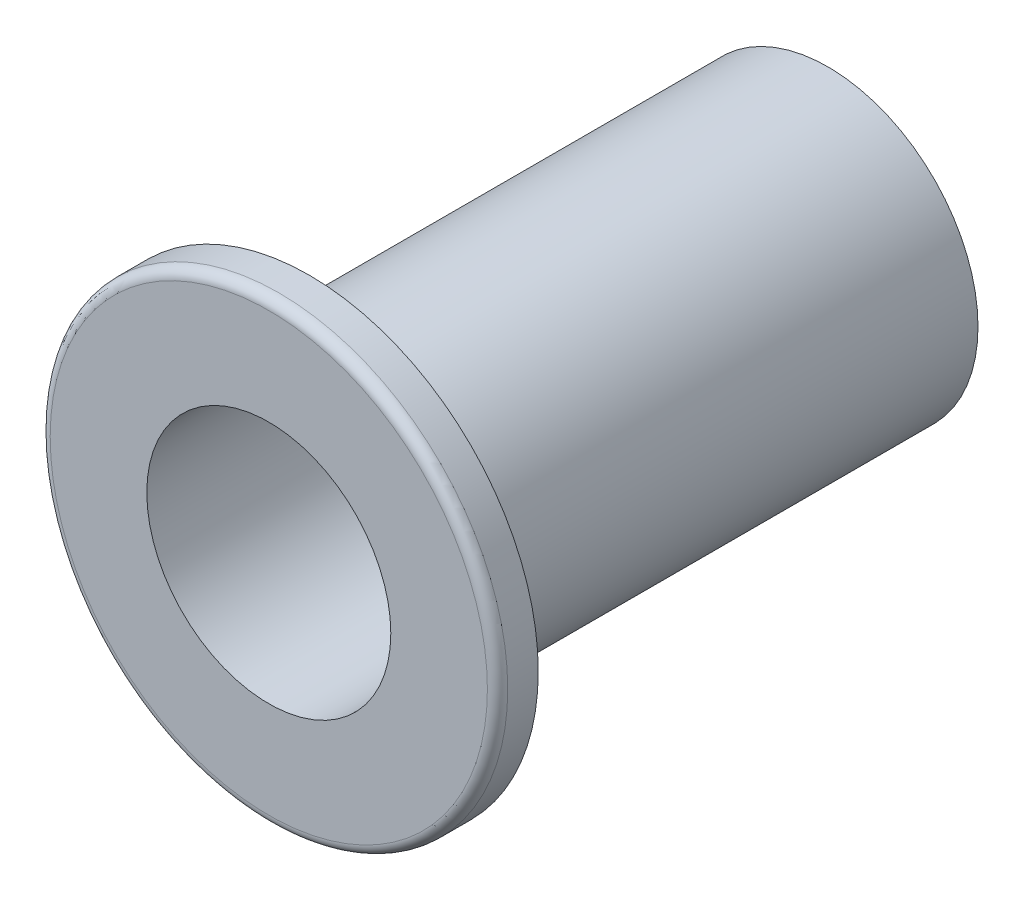
ISO-10303-21;
HEADER;
FILE_DESCRIPTION(('STEP AP214'),'2;1');
FILE_NAME('part.step','',(''),(''),'','','');
FILE_SCHEMA(('AUTOMOTIVE_DESIGN { 1 0 10303 214 1 1 1 1 }'));
ENDSEC;
DATA;
#1=APPLICATION_CONTEXT('core data for automotive mechanical design processes');
#2=APPLICATION_PROTOCOL_DEFINITION('international standard','automotive_design',2000,#1);
#3=PRODUCT_CONTEXT('',#1,'mechanical');
#4=PRODUCT('Part','Part','',(#3));
#5=PRODUCT_RELATED_PRODUCT_CATEGORY('part','',(#4));
#6=PRODUCT_DEFINITION_FORMATION('','',#4);
#7=PRODUCT_DEFINITION_CONTEXT('part definition',#1,'design');
#8=PRODUCT_DEFINITION('design','',#6,#7);
#9=PRODUCT_DEFINITION_SHAPE('','',#8);
#10=(LENGTH_UNIT() NAMED_UNIT(*) SI_UNIT(.MILLI.,.METRE.));
#11=(NAMED_UNIT(*) PLANE_ANGLE_UNIT() SI_UNIT($,.RADIAN.));
#12=(NAMED_UNIT(*) SI_UNIT($,.STERADIAN.) SOLID_ANGLE_UNIT());
#13=UNCERTAINTY_MEASURE_WITH_UNIT(LENGTH_MEASURE(1.E-05),#10,'distance_accuracy_value','');
#14=(GEOMETRIC_REPRESENTATION_CONTEXT(3) GLOBAL_UNCERTAINTY_ASSIGNED_CONTEXT((#13)) GLOBAL_UNIT_ASSIGNED_CONTEXT((#10,
#11,#12)) REPRESENTATION_CONTEXT('',''));
#15=CARTESIAN_POINT('',(0.,0.,0.));
#16=DIRECTION('',(0.,0.,1.));
#17=DIRECTION('',(1.,0.,0.));
#18=AXIS2_PLACEMENT_3D('',#15,#16,#17);
#19=CARTESIAN_POINT('',(0.,0.,0.));
#20=DIRECTION('',(0.,0.,1.));
#21=DIRECTION('',(1.,0.,0.));
#22=AXIS2_PLACEMENT_3D('',#19,#20,#21);
#23=CYLINDRICAL_SURFACE('',#22,4.5);
#24=CARTESIAN_POINT('',(0.,0.,0.6));
#25=DIRECTION('',(0.,0.,-1.));
#26=DIRECTION('',(-1.,0.,0.));
#27=AXIS2_PLACEMENT_3D('',#24,#25,#26);
#28=CIRCLE('',#27,4.5);
#29=CARTESIAN_POINT('',(-4.5,0.,0.6));
#30=VERTEX_POINT('',#29);
#31=EDGE_CURVE('E10',#30,#30,#28,.T.);
#32=ORIENTED_EDGE('',*,*,#31,.T.);
#33=EDGE_LOOP('',(#32));
#34=FACE_BOUND('',#33,.T.);
#35=CARTESIAN_POINT('',(0.,0.,0.));
#36=DIRECTION('',(0.,0.,1.));
#37=DIRECTION('',(1.,0.,0.));
#38=AXIS2_PLACEMENT_3D('',#35,#36,#37);
#39=CIRCLE('',#38,4.5);
#40=CARTESIAN_POINT('',(4.5,0.,0.));
#41=VERTEX_POINT('',#40);
#42=EDGE_CURVE('E66',#41,#41,#39,.T.);
#43=ORIENTED_EDGE('',*,*,#42,.T.);
#44=EDGE_LOOP('',(#43));
#45=FACE_BOUND('',#44,.T.);
#46=ADVANCED_FACE('F34',(#34,#45),#23,.T.);
#47=CARTESIAN_POINT('',(0.,4.5,0.8));
#48=DIRECTION('',(0.,0.,-1.));
#49=DIRECTION('',(-1.,0.,0.));
#50=AXIS2_PLACEMENT_3D('',#47,#48,#49);
#51=PLANE('',#50);
#52=CARTESIAN_POINT('',(0.,0.,0.8));
#53=DIRECTION('',(0.,0.,-1.));
#54=DIRECTION('',(-1.,0.,0.));
#55=AXIS2_PLACEMENT_3D('',#52,#53,#54);
#56=CIRCLE('',#55,4.3);
#57=CARTESIAN_POINT('',(-4.3,0.,0.8));
#58=VERTEX_POINT('',#57);
#59=EDGE_CURVE('E41',#58,#58,#56,.F.);
#60=ORIENTED_EDGE('',*,*,#59,.T.);
#61=EDGE_LOOP('',(#60));
#62=FACE_BOUND('',#61,.T.);
#63=CARTESIAN_POINT('',(0.,0.,0.8));
#64=DIRECTION('',(0.,0.,1.));
#65=DIRECTION('',(1.,0.,0.));
#66=AXIS2_PLACEMENT_3D('',#63,#64,#65);
#67=CIRCLE('',#66,2.4);
#68=CARTESIAN_POINT('',(2.4,0.,0.8));
#69=VERTEX_POINT('',#68);
#70=EDGE_CURVE('E45',#69,#69,#67,.T.);
#71=ORIENTED_EDGE('',*,*,#70,.F.);
#72=EDGE_LOOP('',(#71));
#73=FACE_BOUND('',#72,.T.);
#74=ADVANCED_FACE('F104',(#62,#73),#51,.F.);
#75=CARTESIAN_POINT('',(0.,0.,0.));
#76=DIRECTION('',(0.,0.,1.));
#77=DIRECTION('',(1.,0.,0.));
#78=AXIS2_PLACEMENT_3D('',#75,#76,#77);
#79=CYLINDRICAL_SURFACE('',#78,2.4);
#80=CARTESIAN_POINT('',(0.,0.,-4.2));
#81=DIRECTION('',(0.,0.,1.));
#82=DIRECTION('',(1.,0.,0.));
#83=AXIS2_PLACEMENT_3D('',#80,#81,#82);
#84=CIRCLE('',#83,2.4);
#85=CARTESIAN_POINT('',(2.4,0.,-4.2));
#86=VERTEX_POINT('',#85);
#87=EDGE_CURVE('E49',#86,#86,#84,.T.);
#88=ORIENTED_EDGE('',*,*,#87,.F.);
#89=EDGE_LOOP('',(#88));
#90=FACE_BOUND('',#89,.T.);
#91=ORIENTED_EDGE('',*,*,#70,.T.);
#92=EDGE_LOOP('',(#91));
#93=FACE_BOUND('',#92,.T.);
#94=ADVANCED_FACE('F98',(#90,#93),#79,.F.);
#95=CARTESIAN_POINT('',(0.,2.,-4.2));
#96=DIRECTION('',(0.,0.,-1.));
#97=DIRECTION('',(-1.,0.,0.));
#98=AXIS2_PLACEMENT_3D('',#95,#96,#97);
#99=PLANE('',#98);
#100=CARTESIAN_POINT('',(0.,0.,-4.2));
#101=DIRECTION('',(0.,0.,1.));
#102=DIRECTION('',(1.,0.,0.));
#103=AXIS2_PLACEMENT_3D('',#100,#101,#102);
#104=CIRCLE('',#103,2.);
#105=CARTESIAN_POINT('',(2.,0.,-4.2));
#106=VERTEX_POINT('',#105);
#107=EDGE_CURVE('E54',#106,#106,#104,.T.);
#108=ORIENTED_EDGE('',*,*,#107,.F.);
#109=EDGE_LOOP('',(#108));
#110=FACE_BOUND('',#109,.T.);
#111=ORIENTED_EDGE('',*,*,#87,.T.);
#112=EDGE_LOOP('',(#111));
#113=FACE_BOUND('',#112,.T.);
#114=ADVANCED_FACE('F92',(#110,#113),#99,.F.);
#115=CARTESIAN_POINT('',(0.,0.,0.));
#116=DIRECTION('',(0.,0.,1.));
#117=DIRECTION('',(1.,0.,0.));
#118=AXIS2_PLACEMENT_3D('',#115,#116,#117);
#119=CYLINDRICAL_SURFACE('',#118,2.);
#120=CARTESIAN_POINT('',(0.,0.,-10.2));
#121=DIRECTION('',(0.,0.,1.));
#122=DIRECTION('',(1.,0.,0.));
#123=AXIS2_PLACEMENT_3D('',#120,#121,#122);
#124=CIRCLE('',#123,2.);
#125=CARTESIAN_POINT('',(2.,0.,-10.2));
#126=VERTEX_POINT('',#125);
#127=EDGE_CURVE('E57',#126,#126,#124,.T.);
#128=ORIENTED_EDGE('',*,*,#127,.F.);
#129=EDGE_LOOP('',(#128));
#130=FACE_BOUND('',#129,.T.);
#131=ORIENTED_EDGE('',*,*,#107,.T.);
#132=EDGE_LOOP('',(#131));
#133=FACE_BOUND('',#132,.T.);
#134=ADVANCED_FACE('F86',(#130,#133),#119,.F.);
#135=CARTESIAN_POINT('',(0.,2.,-10.2));
#136=DIRECTION('',(0.,0.,1.));
#137=DIRECTION('',(1.,0.,0.));
#138=AXIS2_PLACEMENT_3D('',#135,#136,#137);
#139=PLANE('',#138);
#140=CARTESIAN_POINT('',(0.,0.,-10.2));
#141=DIRECTION('',(0.,0.,1.));
#142=DIRECTION('',(1.,0.,0.));
#143=AXIS2_PLACEMENT_3D('',#140,#141,#142);
#144=CIRCLE('',#143,2.95);
#145=CARTESIAN_POINT('',(2.95,0.,-10.2));
#146=VERTEX_POINT('',#145);
#147=EDGE_CURVE('E60',#146,#146,#144,.T.);
#148=ORIENTED_EDGE('',*,*,#147,.F.);
#149=EDGE_LOOP('',(#148));
#150=FACE_BOUND('',#149,.T.);
#151=ORIENTED_EDGE('',*,*,#127,.T.);
#152=EDGE_LOOP('',(#151));
#153=FACE_BOUND('',#152,.T.);
#154=ADVANCED_FACE('F80',(#150,#153),#139,.F.);
#155=CARTESIAN_POINT('',(0.,0.,0.));
#156=DIRECTION('',(0.,0.,1.));
#157=DIRECTION('',(1.,0.,0.));
#158=AXIS2_PLACEMENT_3D('',#155,#156,#157);
#159=CYLINDRICAL_SURFACE('',#158,2.95);
#160=CARTESIAN_POINT('',(0.,0.,0.));
#161=DIRECTION('',(0.,0.,1.));
#162=DIRECTION('',(1.,0.,0.));
#163=AXIS2_PLACEMENT_3D('',#160,#161,#162);
#164=CIRCLE('',#163,2.95);
#165=CARTESIAN_POINT('',(2.95,0.,0.));
#166=VERTEX_POINT('',#165);
#167=EDGE_CURVE('E63',#166,#166,#164,.T.);
#168=ORIENTED_EDGE('',*,*,#167,.F.);
#169=EDGE_LOOP('',(#168));
#170=FACE_BOUND('',#169,.T.);
#171=ORIENTED_EDGE('',*,*,#147,.T.);
#172=EDGE_LOOP('',(#171));
#173=FACE_BOUND('',#172,.T.);
#174=ADVANCED_FACE('F74',(#170,#173),#159,.T.);
#175=CARTESIAN_POINT('',(0.,2.95,0.));
#176=DIRECTION('',(0.,0.,1.));
#177=DIRECTION('',(1.,0.,0.));
#178=AXIS2_PLACEMENT_3D('',#175,#176,#177);
#179=PLANE('',#178);
#180=ORIENTED_EDGE('',*,*,#42,.F.);
#181=EDGE_LOOP('',(#180));
#182=FACE_BOUND('',#181,.T.);
#183=ORIENTED_EDGE('',*,*,#167,.T.);
#184=EDGE_LOOP('',(#183));
#185=FACE_BOUND('',#184,.T.);
#186=ADVANCED_FACE('F71',(#182,#185),#179,.F.);
#187=CARTESIAN_POINT('',(0.,0.,0.6));
#188=DIRECTION('',(0.,0.,-1.));
#189=DIRECTION('',(-1.,0.,0.));
#190=AXIS2_PLACEMENT_3D('',#187,#188,#189);
#191=TOROIDAL_SURFACE('',#190,4.3,0.2);
#192=ORIENTED_EDGE('',*,*,#31,.F.);
#193=EDGE_LOOP('',(#192));
#194=FACE_BOUND('',#193,.T.);
#195=ORIENTED_EDGE('',*,*,#59,.F.);
#196=EDGE_LOOP('',(#195));
#197=FACE_BOUND('',#196,.T.);
#198=ADVANCED_FACE('F36',(#194,#197),#191,.T.);
#199=CLOSED_SHELL('',(#46,#74,#94,#114,#134,#154,#174,#186,#198));
#200=MANIFOLD_SOLID_BREP('B2',#199);
#201=ADVANCED_BREP_SHAPE_REPRESENTATION('',(#18,#200),#14);
#202=SHAPE_DEFINITION_REPRESENTATION(#9,#201);
ENDSEC;
END-ISO-10303-21;
